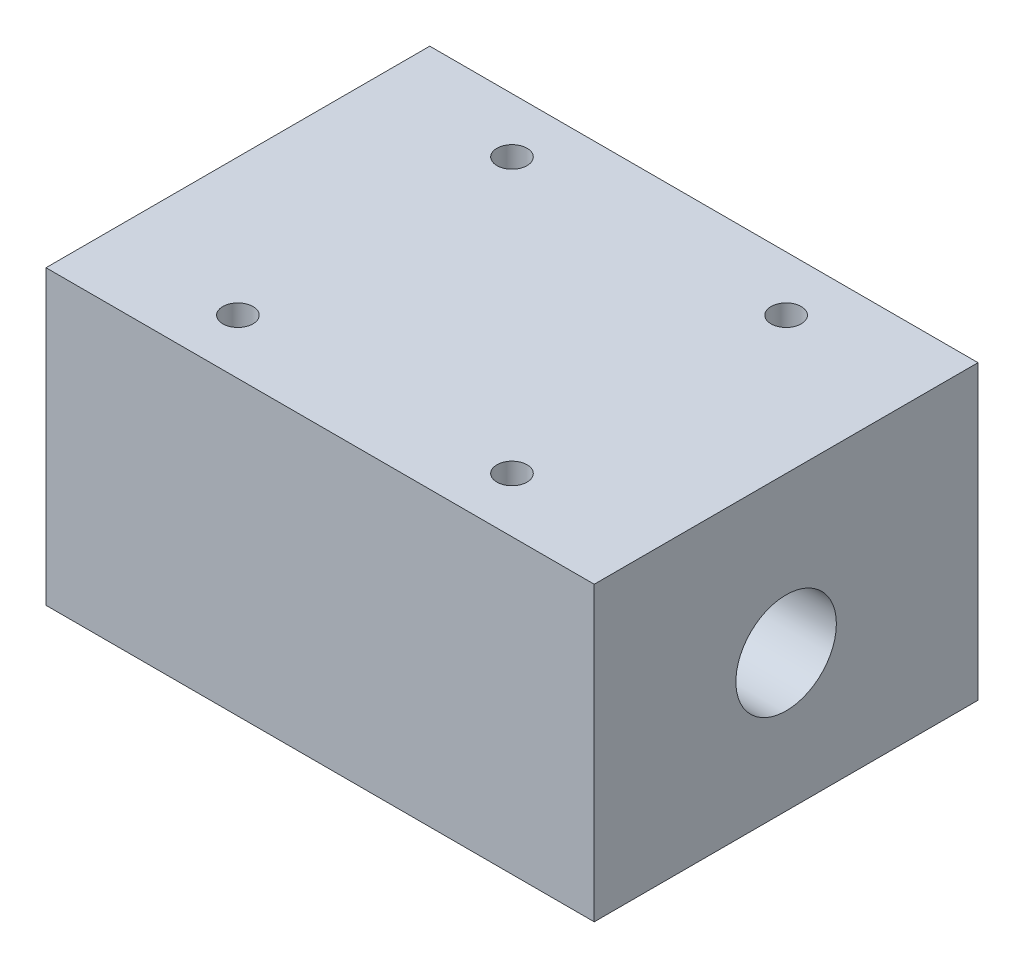
ISO-10303-21;
HEADER;
FILE_DESCRIPTION(('STEP AP214'),'2;1');
FILE_NAME('part.step','',(''),(''),'','','');
FILE_SCHEMA(('AUTOMOTIVE_DESIGN { 1 0 10303 214 1 1 1 1 }'));
ENDSEC;
DATA;
#1=APPLICATION_CONTEXT('core data for automotive mechanical design processes');
#2=APPLICATION_PROTOCOL_DEFINITION('international standard','automotive_design',2000,#1);
#3=PRODUCT_CONTEXT('',#1,'mechanical');
#4=PRODUCT('Part','Part','',(#3));
#5=PRODUCT_RELATED_PRODUCT_CATEGORY('part','',(#4));
#6=PRODUCT_DEFINITION_FORMATION('','',#4);
#7=PRODUCT_DEFINITION_CONTEXT('part definition',#1,'design');
#8=PRODUCT_DEFINITION('design','',#6,#7);
#9=PRODUCT_DEFINITION_SHAPE('','',#8);
#10=(LENGTH_UNIT() NAMED_UNIT(*) SI_UNIT(.MILLI.,.METRE.));
#11=(NAMED_UNIT(*) PLANE_ANGLE_UNIT() SI_UNIT($,.RADIAN.));
#12=(NAMED_UNIT(*) SI_UNIT($,.STERADIAN.) SOLID_ANGLE_UNIT());
#13=UNCERTAINTY_MEASURE_WITH_UNIT(LENGTH_MEASURE(1.E-05),#10,'distance_accuracy_value','');
#14=(GEOMETRIC_REPRESENTATION_CONTEXT(3) GLOBAL_UNCERTAINTY_ASSIGNED_CONTEXT((#13)) GLOBAL_UNIT_ASSIGNED_CONTEXT((#10,
#11,#12)) REPRESENTATION_CONTEXT('',''));
#15=CARTESIAN_POINT('',(0.,0.,0.));
#16=DIRECTION('',(0.,0.,1.));
#17=DIRECTION('',(1.,0.,0.));
#18=AXIS2_PLACEMENT_3D('',#15,#16,#17);
#19=CARTESIAN_POINT('',(30.,32.,21.));
#20=DIRECTION('',(-1.,0.,0.));
#21=DIRECTION('',(0.,0.,1.));
#22=AXIS2_PLACEMENT_3D('',#19,#20,#21);
#23=PLANE('',#22);
#24=CARTESIAN_POINT('',(30.,15.,0.));
#25=DIRECTION('',(1.,0.,0.));
#26=DIRECTION('',(0.,0.,-1.));
#27=AXIS2_PLACEMENT_3D('',#24,#25,#26);
#28=CIRCLE('',#27,5.5);
#29=CARTESIAN_POINT('',(30.,15.,-5.5));
#30=VERTEX_POINT('',#29);
#31=EDGE_CURVE('E189',#30,#30,#28,.T.);
#32=ORIENTED_EDGE('',*,*,#31,.F.);
#33=EDGE_LOOP('',(#32));
#34=FACE_BOUND('',#33,.T.);
#35=DIRECTION('',(0.,0.,-1.));
#36=VECTOR('',#35,1.);
#37=CARTESIAN_POINT('',(30.,0.,21.));
#38=LINE('',#37,#36);
#39=CARTESIAN_POINT('',(30.,0.,21.));
#40=VERTEX_POINT('',#39);
#41=CARTESIAN_POINT('',(30.,0.,-21.));
#42=VERTEX_POINT('',#41);
#43=EDGE_CURVE('E142',#40,#42,#38,.T.);
#44=ORIENTED_EDGE('',*,*,#43,.T.);
#45=DIRECTION('',(0.,-1.,0.));
#46=VECTOR('',#45,1.);
#47=CARTESIAN_POINT('',(30.,32.,-21.));
#48=LINE('',#47,#46);
#49=CARTESIAN_POINT('',(30.,32.,-21.));
#50=VERTEX_POINT('',#49);
#51=EDGE_CURVE('E11',#50,#42,#48,.T.);
#52=ORIENTED_EDGE('',*,*,#51,.F.);
#53=DIRECTION('',(0.,0.,-1.));
#54=VECTOR('',#53,1.);
#55=CARTESIAN_POINT('',(30.,32.,21.));
#56=LINE('',#55,#54);
#57=CARTESIAN_POINT('',(30.,32.,21.));
#58=VERTEX_POINT('',#57);
#59=EDGE_CURVE('E143',#58,#50,#56,.T.);
#60=ORIENTED_EDGE('',*,*,#59,.F.);
#61=DIRECTION('',(0.,-1.,0.));
#62=VECTOR('',#61,1.);
#63=CARTESIAN_POINT('',(30.,32.,21.));
#64=LINE('',#63,#62);
#65=EDGE_CURVE('E149',#58,#40,#64,.T.);
#66=ORIENTED_EDGE('',*,*,#65,.T.);
#67=EDGE_LOOP('',(#44,#52,#60,#66));
#68=FACE_BOUND('',#67,.T.);
#69=ADVANCED_FACE('F47',(#34,#68),#23,.F.);
#70=CARTESIAN_POINT('',(-30.,32.,-21.));
#71=DIRECTION('',(0.,0.,1.));
#72=DIRECTION('',(1.,0.,0.));
#73=AXIS2_PLACEMENT_3D('',#70,#71,#72);
#74=PLANE('',#73);
#75=DIRECTION('',(-1.,0.,0.));
#76=VECTOR('',#75,1.);
#77=CARTESIAN_POINT('',(-30.,0.,-21.));
#78=LINE('',#77,#76);
#79=CARTESIAN_POINT('',(-30.,0.,-21.));
#80=VERTEX_POINT('',#79);
#81=EDGE_CURVE('E152',#42,#80,#78,.T.);
#82=ORIENTED_EDGE('',*,*,#81,.T.);
#83=DIRECTION('',(0.,-1.,0.));
#84=VECTOR('',#83,1.);
#85=CARTESIAN_POINT('',(-30.,32.,-21.));
#86=LINE('',#85,#84);
#87=CARTESIAN_POINT('',(-30.,32.,-21.));
#88=VERTEX_POINT('',#87);
#89=EDGE_CURVE('E55',#88,#80,#86,.T.);
#90=ORIENTED_EDGE('',*,*,#89,.F.);
#91=DIRECTION('',(-1.,0.,0.));
#92=VECTOR('',#91,1.);
#93=CARTESIAN_POINT('',(-30.,32.,-21.));
#94=LINE('',#93,#92);
#95=EDGE_CURVE('E94',#50,#88,#94,.T.);
#96=ORIENTED_EDGE('',*,*,#95,.F.);
#97=ORIENTED_EDGE('',*,*,#51,.T.);
#98=EDGE_LOOP('',(#82,#90,#96,#97));
#99=FACE_BOUND('',#98,.T.);
#100=ADVANCED_FACE('F178',(#99),#74,.F.);
#101=CARTESIAN_POINT('',(-30.,32.,21.));
#102=DIRECTION('',(1.,0.,0.));
#103=DIRECTION('',(0.,0.,-1.));
#104=AXIS2_PLACEMENT_3D('',#101,#102,#103);
#105=PLANE('',#104);
#106=CARTESIAN_POINT('',(-30.,15.,0.));
#107=DIRECTION('',(1.,0.,0.));
#108=DIRECTION('',(0.,0.,-1.));
#109=AXIS2_PLACEMENT_3D('',#106,#107,#108);
#110=CIRCLE('',#109,5.5);
#111=CARTESIAN_POINT('',(-30.,15.,-5.5));
#112=VERTEX_POINT('',#111);
#113=EDGE_CURVE('E124',#112,#112,#110,.T.);
#114=ORIENTED_EDGE('',*,*,#113,.T.);
#115=EDGE_LOOP('',(#114));
#116=FACE_BOUND('',#115,.T.);
#117=DIRECTION('',(0.,0.,1.));
#118=VECTOR('',#117,1.);
#119=CARTESIAN_POINT('',(-30.,0.,21.));
#120=LINE('',#119,#118);
#121=CARTESIAN_POINT('',(-30.,0.,21.));
#122=VERTEX_POINT('',#121);
#123=EDGE_CURVE('E81',#80,#122,#120,.T.);
#124=ORIENTED_EDGE('',*,*,#123,.T.);
#125=DIRECTION('',(0.,-1.,0.));
#126=VECTOR('',#125,1.);
#127=CARTESIAN_POINT('',(-30.,32.,21.));
#128=LINE('',#127,#126);
#129=CARTESIAN_POINT('',(-30.,32.,21.));
#130=VERTEX_POINT('',#129);
#131=EDGE_CURVE('E157',#130,#122,#128,.T.);
#132=ORIENTED_EDGE('',*,*,#131,.F.);
#133=DIRECTION('',(0.,0.,1.));
#134=VECTOR('',#133,1.);
#135=CARTESIAN_POINT('',(-30.,32.,21.));
#136=LINE('',#135,#134);
#137=EDGE_CURVE('E146',#88,#130,#136,.T.);
#138=ORIENTED_EDGE('',*,*,#137,.F.);
#139=ORIENTED_EDGE('',*,*,#89,.T.);
#140=EDGE_LOOP('',(#124,#132,#138,#139));
#141=FACE_BOUND('',#140,.T.);
#142=ADVANCED_FACE('F159',(#116,#141),#105,.F.);
#143=CARTESIAN_POINT('',(-30.,32.,21.));
#144=DIRECTION('',(0.,0.,-1.));
#145=DIRECTION('',(-1.,0.,0.));
#146=AXIS2_PLACEMENT_3D('',#143,#144,#145);
#147=PLANE('',#146);
#148=DIRECTION('',(1.,0.,0.));
#149=VECTOR('',#148,1.);
#150=CARTESIAN_POINT('',(-30.,0.,21.));
#151=LINE('',#150,#149);
#152=EDGE_CURVE('E87',#122,#40,#151,.T.);
#153=ORIENTED_EDGE('',*,*,#152,.T.);
#154=ORIENTED_EDGE('',*,*,#65,.F.);
#155=DIRECTION('',(1.,0.,0.));
#156=VECTOR('',#155,1.);
#157=CARTESIAN_POINT('',(-30.,32.,21.));
#158=LINE('',#157,#156);
#159=EDGE_CURVE('E63',#130,#58,#158,.T.);
#160=ORIENTED_EDGE('',*,*,#159,.F.);
#161=ORIENTED_EDGE('',*,*,#131,.T.);
#162=EDGE_LOOP('',(#153,#154,#160,#161));
#163=FACE_BOUND('',#162,.T.);
#164=ADVANCED_FACE('F166',(#163),#147,.F.);
#165=CARTESIAN_POINT('',(0.,32.,0.));
#166=DIRECTION('',(0.,-1.,0.));
#167=DIRECTION('',(0.,0.,-1.));
#168=AXIS2_PLACEMENT_3D('',#165,#166,#167);
#169=PLANE('',#168);
#170=CARTESIAN_POINT('',(15.,32.,-15.));
#171=DIRECTION('',(0.,1.,0.));
#172=DIRECTION('',(0.,0.,1.));
#173=AXIS2_PLACEMENT_3D('',#170,#171,#172);
#174=CIRCLE('',#173,1.64999999999999);
#175=CARTESIAN_POINT('',(15.,32.,-13.35));
#176=VERTEX_POINT('',#175);
#177=EDGE_CURVE('E118',#176,#176,#174,.T.);
#178=ORIENTED_EDGE('',*,*,#177,.F.);
#179=EDGE_LOOP('',(#178));
#180=FACE_BOUND('',#179,.T.);
#181=CARTESIAN_POINT('',(-15.,32.,-15.));
#182=DIRECTION('',(0.,1.,0.));
#183=DIRECTION('',(0.,0.,1.));
#184=AXIS2_PLACEMENT_3D('',#181,#182,#183);
#185=CIRCLE('',#184,1.64999999999999);
#186=CARTESIAN_POINT('',(-15.,32.,-13.35));
#187=VERTEX_POINT('',#186);
#188=EDGE_CURVE('E117',#187,#187,#185,.T.);
#189=ORIENTED_EDGE('',*,*,#188,.F.);
#190=EDGE_LOOP('',(#189));
#191=FACE_BOUND('',#190,.T.);
#192=CARTESIAN_POINT('',(-15.,32.,15.));
#193=DIRECTION('',(0.,1.,0.));
#194=DIRECTION('',(0.,0.,1.));
#195=AXIS2_PLACEMENT_3D('',#192,#193,#194);
#196=CIRCLE('',#195,1.64999999999999);
#197=CARTESIAN_POINT('',(-15.,32.,16.65));
#198=VERTEX_POINT('',#197);
#199=EDGE_CURVE('E130',#198,#198,#196,.T.);
#200=ORIENTED_EDGE('',*,*,#199,.F.);
#201=EDGE_LOOP('',(#200));
#202=FACE_BOUND('',#201,.T.);
#203=CARTESIAN_POINT('',(15.,32.,15.));
#204=DIRECTION('',(0.,1.,0.));
#205=DIRECTION('',(0.,0.,1.));
#206=AXIS2_PLACEMENT_3D('',#203,#204,#205);
#207=CIRCLE('',#206,1.64999999999999);
#208=CARTESIAN_POINT('',(15.,32.,16.65));
#209=VERTEX_POINT('',#208);
#210=EDGE_CURVE('E136',#209,#209,#207,.T.);
#211=ORIENTED_EDGE('',*,*,#210,.F.);
#212=EDGE_LOOP('',(#211));
#213=FACE_BOUND('',#212,.T.);
#214=ORIENTED_EDGE('',*,*,#59,.T.);
#215=ORIENTED_EDGE('',*,*,#95,.T.);
#216=ORIENTED_EDGE('',*,*,#137,.T.);
#217=ORIENTED_EDGE('',*,*,#159,.T.);
#218=EDGE_LOOP('',(#214,#215,#216,#217));
#219=FACE_BOUND('',#218,.T.);
#220=ADVANCED_FACE('F168',(#180,#191,#202,#213,#219),#169,.F.);
#221=CARTESIAN_POINT('',(0.,0.,0.));
#222=DIRECTION('',(0.,-1.,0.));
#223=DIRECTION('',(0.,0.,-1.));
#224=AXIS2_PLACEMENT_3D('',#221,#222,#223);
#225=PLANE('',#224);
#226=ORIENTED_EDGE('',*,*,#43,.F.);
#227=ORIENTED_EDGE('',*,*,#152,.F.);
#228=ORIENTED_EDGE('',*,*,#123,.F.);
#229=ORIENTED_EDGE('',*,*,#81,.F.);
#230=EDGE_LOOP('',(#226,#227,#228,#229));
#231=FACE_BOUND('',#230,.T.);
#232=ADVANCED_FACE('F162',(#231),#225,.T.);
#233=CARTESIAN_POINT('',(15.,17.,15.));
#234=DIRECTION('',(0.,1.,0.));
#235=DIRECTION('',(0.,0.,1.));
#236=AXIS2_PLACEMENT_3D('',#233,#234,#235);
#237=CONICAL_SURFACE('',#236,1.65,1.02974425867665);
#238=CARTESIAN_POINT('',(15.,16.0085799786045,15.));
#239=VERTEX_POINT('',#238);
#240=VERTEX_LOOP('',#239);
#241=FACE_BOUND('',#240,.T.);
#242=CARTESIAN_POINT('',(15.,17.,15.));
#243=DIRECTION('',(0.,1.,0.));
#244=DIRECTION('',(0.,0.,1.));
#245=AXIS2_PLACEMENT_3D('',#242,#243,#244);
#246=CIRCLE('',#245,1.65);
#247=CARTESIAN_POINT('',(15.,17.,16.65));
#248=VERTEX_POINT('',#247);
#249=EDGE_CURVE('E139',#248,#248,#246,.T.);
#250=ORIENTED_EDGE('',*,*,#249,.T.);
#251=EDGE_LOOP('',(#250));
#252=FACE_BOUND('',#251,.T.);
#253=ADVANCED_FACE('F221',(#241,#252),#237,.F.);
#254=CARTESIAN_POINT('',(15.,32.,15.));
#255=DIRECTION('',(0.,1.,0.));
#256=DIRECTION('',(0.,0.,1.));
#257=AXIS2_PLACEMENT_3D('',#254,#255,#256);
#258=CYLINDRICAL_SURFACE('',#257,1.64999999999999);
#259=ORIENTED_EDGE('',*,*,#249,.F.);
#260=EDGE_LOOP('',(#259));
#261=FACE_BOUND('',#260,.T.);
#262=ORIENTED_EDGE('',*,*,#210,.T.);
#263=EDGE_LOOP('',(#262));
#264=FACE_BOUND('',#263,.T.);
#265=ADVANCED_FACE('F217',(#261,#264),#258,.F.);
#266=CARTESIAN_POINT('',(-15.,17.,15.));
#267=DIRECTION('',(0.,1.,0.));
#268=DIRECTION('',(0.,0.,1.));
#269=AXIS2_PLACEMENT_3D('',#266,#267,#268);
#270=CONICAL_SURFACE('',#269,1.65,1.02974425867665);
#271=CARTESIAN_POINT('',(-15.,16.0085799786045,15.));
#272=VERTEX_POINT('',#271);
#273=VERTEX_LOOP('',#272);
#274=FACE_BOUND('',#273,.T.);
#275=CARTESIAN_POINT('',(-15.,17.,15.));
#276=DIRECTION('',(0.,1.,0.));
#277=DIRECTION('',(0.,0.,1.));
#278=AXIS2_PLACEMENT_3D('',#275,#276,#277);
#279=CIRCLE('',#278,1.65);
#280=CARTESIAN_POINT('',(-15.,17.,16.65));
#281=VERTEX_POINT('',#280);
#282=EDGE_CURVE('E133',#281,#281,#279,.T.);
#283=ORIENTED_EDGE('',*,*,#282,.T.);
#284=EDGE_LOOP('',(#283));
#285=FACE_BOUND('',#284,.T.);
#286=ADVANCED_FACE('F213',(#274,#285),#270,.F.);
#287=CARTESIAN_POINT('',(-15.,32.,15.));
#288=DIRECTION('',(0.,1.,0.));
#289=DIRECTION('',(0.,0.,1.));
#290=AXIS2_PLACEMENT_3D('',#287,#288,#289);
#291=CYLINDRICAL_SURFACE('',#290,1.64999999999999);
#292=ORIENTED_EDGE('',*,*,#282,.F.);
#293=EDGE_LOOP('',(#292));
#294=FACE_BOUND('',#293,.T.);
#295=ORIENTED_EDGE('',*,*,#199,.T.);
#296=EDGE_LOOP('',(#295));
#297=FACE_BOUND('',#296,.T.);
#298=ADVANCED_FACE('F209',(#294,#297),#291,.F.);
#299=CARTESIAN_POINT('',(-15.,17.,-15.));
#300=DIRECTION('',(0.,1.,0.));
#301=DIRECTION('',(0.,0.,1.));
#302=AXIS2_PLACEMENT_3D('',#299,#300,#301);
#303=CONICAL_SURFACE('',#302,1.65,1.02974425867665);
#304=CARTESIAN_POINT('',(-15.,16.0085799786045,-15.));
#305=VERTEX_POINT('',#304);
#306=VERTEX_LOOP('',#305);
#307=FACE_BOUND('',#306,.T.);
#308=CARTESIAN_POINT('',(-15.,17.,-15.));
#309=DIRECTION('',(0.,1.,0.));
#310=DIRECTION('',(0.,0.,1.));
#311=AXIS2_PLACEMENT_3D('',#308,#309,#310);
#312=CIRCLE('',#311,1.65);
#313=CARTESIAN_POINT('',(-15.,17.,-13.35));
#314=VERTEX_POINT('',#313);
#315=EDGE_CURVE('E121',#314,#314,#312,.T.);
#316=ORIENTED_EDGE('',*,*,#315,.T.);
#317=EDGE_LOOP('',(#316));
#318=FACE_BOUND('',#317,.T.);
#319=ADVANCED_FACE('F205',(#307,#318),#303,.F.);
#320=CARTESIAN_POINT('',(-15.,32.,-15.));
#321=DIRECTION('',(0.,1.,0.));
#322=DIRECTION('',(0.,0.,1.));
#323=AXIS2_PLACEMENT_3D('',#320,#321,#322);
#324=CYLINDRICAL_SURFACE('',#323,1.64999999999999);
#325=ORIENTED_EDGE('',*,*,#315,.F.);
#326=EDGE_LOOP('',(#325));
#327=FACE_BOUND('',#326,.T.);
#328=ORIENTED_EDGE('',*,*,#188,.T.);
#329=EDGE_LOOP('',(#328));
#330=FACE_BOUND('',#329,.T.);
#331=ADVANCED_FACE('F111',(#327,#330),#324,.F.);
#332=CARTESIAN_POINT('',(15.,17.,-15.));
#333=DIRECTION('',(0.,1.,0.));
#334=DIRECTION('',(0.,0.,1.));
#335=AXIS2_PLACEMENT_3D('',#332,#333,#334);
#336=CONICAL_SURFACE('',#335,1.65,1.02974425867665);
#337=CARTESIAN_POINT('',(15.,16.0085799786045,-15.));
#338=VERTEX_POINT('',#337);
#339=VERTEX_LOOP('',#338);
#340=FACE_BOUND('',#339,.T.);
#341=CARTESIAN_POINT('',(15.,17.,-15.));
#342=DIRECTION('',(0.,1.,0.));
#343=DIRECTION('',(0.,0.,1.));
#344=AXIS2_PLACEMENT_3D('',#341,#342,#343);
#345=CIRCLE('',#344,1.65);
#346=CARTESIAN_POINT('',(15.,17.,-13.35));
#347=VERTEX_POINT('',#346);
#348=EDGE_CURVE('E115',#347,#347,#345,.T.);
#349=ORIENTED_EDGE('',*,*,#348,.T.);
#350=EDGE_LOOP('',(#349));
#351=FACE_BOUND('',#350,.T.);
#352=ADVANCED_FACE('F107',(#340,#351),#336,.F.);
#353=CARTESIAN_POINT('',(15.,32.,-15.));
#354=DIRECTION('',(0.,1.,0.));
#355=DIRECTION('',(0.,0.,1.));
#356=AXIS2_PLACEMENT_3D('',#353,#354,#355);
#357=CYLINDRICAL_SURFACE('',#356,1.64999999999999);
#358=ORIENTED_EDGE('',*,*,#348,.F.);
#359=EDGE_LOOP('',(#358));
#360=FACE_BOUND('',#359,.T.);
#361=ORIENTED_EDGE('',*,*,#177,.T.);
#362=EDGE_LOOP('',(#361));
#363=FACE_BOUND('',#362,.T.);
#364=ADVANCED_FACE('F110',(#360,#363),#357,.F.);
#365=CARTESIAN_POINT('',(-30.,15.,0.));
#366=DIRECTION('',(1.,0.,0.));
#367=DIRECTION('',(0.,0.,-1.));
#368=AXIS2_PLACEMENT_3D('',#365,#366,#367);
#369=CYLINDRICAL_SURFACE('',#368,5.5);
#370=CARTESIAN_POINT('',(-30.,15.,-5.5));
#371=CARTESIAN_POINT('',(-29.375,15.,-5.5));
#372=CARTESIAN_POINT('',(-28.75,15.,-5.5));
#373=CARTESIAN_POINT('',(-27.5,15.,-5.5));
#374=CARTESIAN_POINT('',(-26.875,15.,-5.5));
#375=CARTESIAN_POINT('',(-25.625,15.,-5.5));
#376=CARTESIAN_POINT('',(-25.,15.,-5.5));
#377=CARTESIAN_POINT('',(-23.75,15.,-5.5));
#378=CARTESIAN_POINT('',(-23.125,15.,-5.5));
#379=CARTESIAN_POINT('',(-21.875,15.,-5.5));
#380=CARTESIAN_POINT('',(-21.25,15.,-5.5));
#381=CARTESIAN_POINT('',(-20.,15.,-5.5));
#382=CARTESIAN_POINT('',(-19.375,15.,-5.5));
#383=CARTESIAN_POINT('',(-18.125,15.,-5.5));
#384=CARTESIAN_POINT('',(-17.5,15.,-5.5));
#385=CARTESIAN_POINT('',(-16.25,15.,-5.5));
#386=CARTESIAN_POINT('',(-15.625,15.,-5.5));
#387=CARTESIAN_POINT('',(-14.375,15.,-5.5));
#388=CARTESIAN_POINT('',(-13.75,15.,-5.5));
#389=CARTESIAN_POINT('',(-12.5,15.,-5.5));
#390=CARTESIAN_POINT('',(-11.875,15.,-5.5));
#391=CARTESIAN_POINT('',(-10.625,15.,-5.5));
#392=CARTESIAN_POINT('',(-10.,15.,-5.5));
#393=CARTESIAN_POINT('',(-8.75000000000001,15.,-5.5));
#394=CARTESIAN_POINT('',(-8.12500000000001,15.,-5.5));
#395=CARTESIAN_POINT('',(-6.87500000000001,15.,-5.5));
#396=CARTESIAN_POINT('',(-6.25000000000001,15.,-5.5));
#397=CARTESIAN_POINT('',(-5.00000000000001,15.,-5.5));
#398=CARTESIAN_POINT('',(-4.37500000000001,15.,-5.5));
#399=CARTESIAN_POINT('',(-3.12500000000001,15.,-5.5));
#400=CARTESIAN_POINT('',(-2.50000000000001,15.,-5.5));
#401=CARTESIAN_POINT('',(-1.25000000000001,15.,-5.5));
#402=CARTESIAN_POINT('',(-0.625000000000008,15.,-5.5));
#403=CARTESIAN_POINT('',(0.624999999999994,15.,-5.5));
#404=CARTESIAN_POINT('',(1.24999999999999,15.,-5.5));
#405=CARTESIAN_POINT('',(2.5,15.,-5.5));
#406=CARTESIAN_POINT('',(3.125,15.,-5.5));
#407=CARTESIAN_POINT('',(4.37499999999999,15.,-5.5));
#408=CARTESIAN_POINT('',(4.99999999999999,15.,-5.5));
#409=CARTESIAN_POINT('',(6.24999999999999,15.,-5.5));
#410=CARTESIAN_POINT('',(6.87499999999999,15.,-5.5));
#411=CARTESIAN_POINT('',(8.12499999999999,15.,-5.5));
#412=CARTESIAN_POINT('',(8.74999999999999,15.,-5.5));
#413=CARTESIAN_POINT('',(9.99999999999999,15.,-5.5));
#414=CARTESIAN_POINT('',(10.625,15.,-5.5));
#415=CARTESIAN_POINT('',(11.875,15.,-5.5));
#416=CARTESIAN_POINT('',(12.5,15.,-5.5));
#417=CARTESIAN_POINT('',(13.75,15.,-5.5));
#418=CARTESIAN_POINT('',(14.375,15.,-5.5));
#419=CARTESIAN_POINT('',(15.625,15.,-5.5));
#420=CARTESIAN_POINT('',(16.25,15.,-5.5));
#421=CARTESIAN_POINT('',(17.5,15.,-5.5));
#422=CARTESIAN_POINT('',(18.125,15.,-5.5));
#423=CARTESIAN_POINT('',(19.375,15.,-5.5));
#424=CARTESIAN_POINT('',(20.,15.,-5.5));
#425=CARTESIAN_POINT('',(21.25,15.,-5.5));
#426=CARTESIAN_POINT('',(21.875,15.,-5.5));
#427=CARTESIAN_POINT('',(23.125,15.,-5.5));
#428=CARTESIAN_POINT('',(23.75,15.,-5.5));
#429=CARTESIAN_POINT('',(25.,15.,-5.5));
#430=CARTESIAN_POINT('',(25.625,15.,-5.5));
#431=CARTESIAN_POINT('',(26.875,15.,-5.5));
#432=CARTESIAN_POINT('',(27.5,15.,-5.5));
#433=CARTESIAN_POINT('',(28.75,15.,-5.5));
#434=CARTESIAN_POINT('',(29.375,15.,-5.5));
#435=CARTESIAN_POINT('',(30.,15.,-5.5));
#436=B_SPLINE_CURVE_WITH_KNOTS('',3,(#370,#371,#372,#373,#374,#375,#376,#377,#378,#379,#380,
#381,#382,#383,#384,#385,#386,#387,#388,#389,#390,#391,#392,#393,#394,#395,#396,#397,#398,#399,
#400,#401,#402,#403,#404,#405,#406,#407,#408,#409,#410,#411,#412,#413,#414,#415,#416,#417,#418,
#419,#420,#421,#422,#423,#424,#425,#426,#427,#428,#429,#430,#431,#432,#433,#434,#435),
.UNSPECIFIED.,.F.,.F.,(4,2,2,2,2,2,2,2,2,2,2,2,2,2,2,2,2,2,2,2,2,2,2,2,2,2,2,2,2,2,2,2,4),(0.,
1.875,3.75,5.625,7.5,9.375,11.25,13.125,15.,16.875,18.75,20.625,22.5,24.375,26.25,28.125,30.,
31.875,33.75,35.625,37.5,39.375,41.25,43.125,45.,46.875,48.75,50.625,52.5,54.375,56.25,58.125,
60.),.UNSPECIFIED.);
#437=EDGE_CURVE('BSEAM195',#112,#30,#436,.T.);
#438=ORIENTED_EDGE('',*,*,#113,.F.);
#439=ORIENTED_EDGE('',*,*,#31,.T.);
#440=ORIENTED_EDGE('',*,*,#437,.T.);
#441=ORIENTED_EDGE('',*,*,#437,.F.);
#442=EDGE_LOOP('',(#438,#440,#439,#441));
#443=FACE_BOUND('',#442,.T.);
#444=ADVANCED_FACE('F195',(#443),#369,.F.);
#445=CLOSED_SHELL('',(#69,#100,#142,#164,#220,#232,#253,#265,#286,#298,#319,#331,#352,#364,#444));
#446=MANIFOLD_SOLID_BREP('B2',#445);
#447=ADVANCED_BREP_SHAPE_REPRESENTATION('',(#18,#446),#14);
#448=SHAPE_DEFINITION_REPRESENTATION(#9,#447);
ENDSEC;
END-ISO-10303-21;
